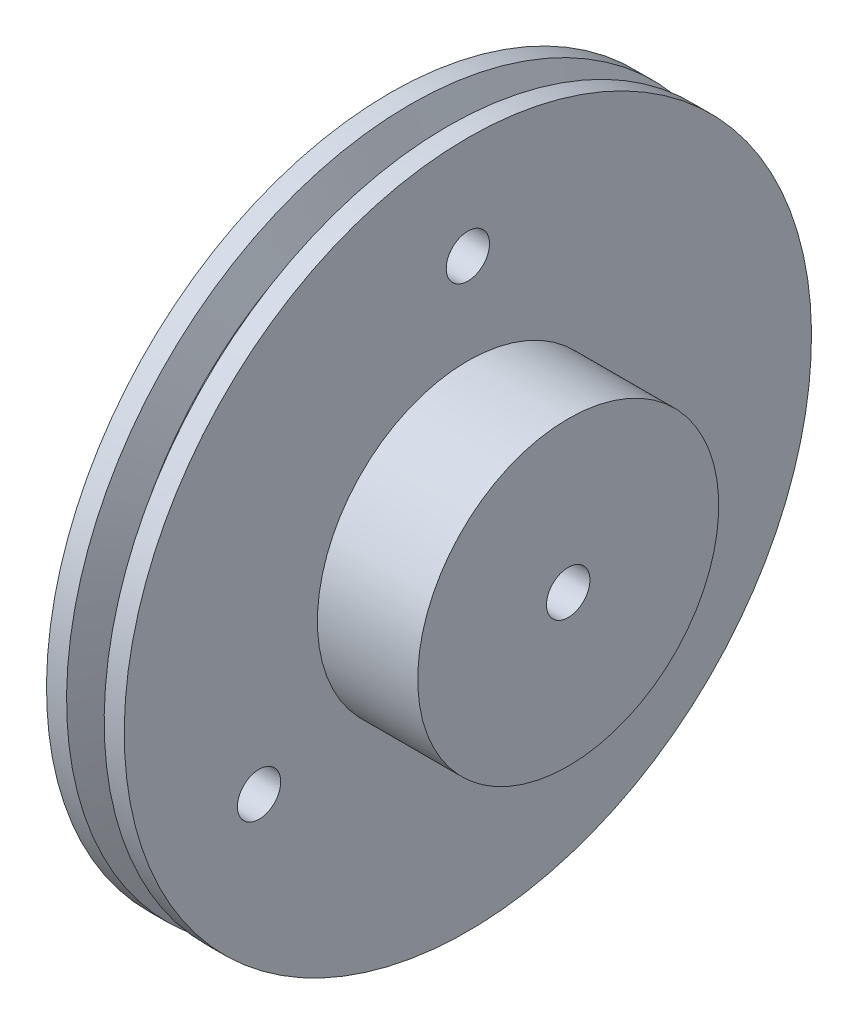
ISO-10303-21;
HEADER;
FILE_DESCRIPTION(('STEP AP214'),'2;1');
FILE_NAME('part.step','',(''),(''),'','','');
FILE_SCHEMA(('AUTOMOTIVE_DESIGN { 1 0 10303 214 1 1 1 1 }'));
ENDSEC;
DATA;
#1=APPLICATION_CONTEXT('core data for automotive mechanical design processes');
#2=APPLICATION_PROTOCOL_DEFINITION('international standard','automotive_design',2000,#1);
#3=PRODUCT_CONTEXT('',#1,'mechanical');
#4=PRODUCT('Part','Part','',(#3));
#5=PRODUCT_RELATED_PRODUCT_CATEGORY('part','',(#4));
#6=PRODUCT_DEFINITION_FORMATION('','',#4);
#7=PRODUCT_DEFINITION_CONTEXT('part definition',#1,'design');
#8=PRODUCT_DEFINITION('design','',#6,#7);
#9=PRODUCT_DEFINITION_SHAPE('','',#8);
#10=(LENGTH_UNIT() NAMED_UNIT(*) SI_UNIT(.MILLI.,.METRE.));
#11=(NAMED_UNIT(*) PLANE_ANGLE_UNIT() SI_UNIT($,.RADIAN.));
#12=(NAMED_UNIT(*) SI_UNIT($,.STERADIAN.) SOLID_ANGLE_UNIT());
#13=UNCERTAINTY_MEASURE_WITH_UNIT(LENGTH_MEASURE(1.E-05),#10,'distance_accuracy_value','');
#14=(GEOMETRIC_REPRESENTATION_CONTEXT(3) GLOBAL_UNCERTAINTY_ASSIGNED_CONTEXT((#13)) GLOBAL_UNIT_ASSIGNED_CONTEXT((#10,
#11,#12)) REPRESENTATION_CONTEXT('',''));
#15=CARTESIAN_POINT('',(0.,0.,0.));
#16=DIRECTION('',(0.,0.,1.));
#17=DIRECTION('',(1.,0.,0.));
#18=AXIS2_PLACEMENT_3D('',#15,#16,#17);
#19=CARTESIAN_POINT('',(0.,0.,0.));
#20=DIRECTION('',(-1.,0.,0.));
#21=DIRECTION('',(0.,-1.,0.));
#22=AXIS2_PLACEMENT_3D('',#19,#20,#21);
#23=PLANE('',#22);
#24=CARTESIAN_POINT('',(0.,61.0398885653455,0.));
#25=DIRECTION('',(1.,0.,0.));
#26=DIRECTION('',(0.,1.,0.));
#27=AXIS2_PLACEMENT_3D('',#24,#25,#26);
#28=CIRCLE('',#27,5.48117719171677);
#29=CARTESIAN_POINT('',(0.,66.5210657570623,0.));
#30=VERTEX_POINT('',#29);
#31=EDGE_CURVE('E70',#30,#30,#28,.T.);
#32=ORIENTED_EDGE('',*,*,#31,.T.);
#33=EDGE_LOOP('',(#32));
#34=FACE_BOUND('',#33,.T.);
#35=CARTESIAN_POINT('',(0.,-30.5199442826705,-52.8620941417644));
#36=DIRECTION('',(1.,0.,0.));
#37=DIRECTION('',(0.,1.,0.));
#38=AXIS2_PLACEMENT_3D('',#35,#36,#37);
#39=CIRCLE('',#38,5.48117719172016);
#40=CARTESIAN_POINT('',(0.,-25.0387670909503,-52.8620941417644));
#41=VERTEX_POINT('',#40);
#42=EDGE_CURVE('E79',#41,#41,#39,.T.);
#43=ORIENTED_EDGE('',*,*,#42,.T.);
#44=EDGE_LOOP('',(#43));
#45=FACE_BOUND('',#44,.T.);
#46=CARTESIAN_POINT('',(0.,-30.519944282675,52.8620941417566));
#47=DIRECTION('',(1.,0.,0.));
#48=DIRECTION('',(0.,1.,0.));
#49=AXIS2_PLACEMENT_3D('',#46,#47,#48);
#50=CIRCLE('',#49,5.48117719172171);
#51=CARTESIAN_POINT('',(0.,-25.0387670909533,52.8620941417566));
#52=VERTEX_POINT('',#51);
#53=EDGE_CURVE('E73',#52,#52,#50,.T.);
#54=ORIENTED_EDGE('',*,*,#53,.T.);
#55=EDGE_LOOP('',(#54));
#56=FACE_BOUND('',#55,.T.);
#57=CARTESIAN_POINT('',(0.,0.,0.));
#58=DIRECTION('',(1.,0.,0.));
#59=DIRECTION('',(0.,1.,0.));
#60=AXIS2_PLACEMENT_3D('',#57,#58,#59);
#61=CIRCLE('',#60,5.5);
#62=CARTESIAN_POINT('',(0.,5.5,0.));
#63=VERTEX_POINT('',#62);
#64=EDGE_CURVE('E66',#63,#63,#61,.T.);
#65=ORIENTED_EDGE('',*,*,#64,.T.);
#66=EDGE_LOOP('',(#65));
#67=FACE_BOUND('',#66,.T.);
#68=CARTESIAN_POINT('',(0.,0.,0.));
#69=DIRECTION('',(1.,0.,0.));
#70=DIRECTION('',(0.,1.,0.));
#71=AXIS2_PLACEMENT_3D('',#68,#69,#70);
#72=CIRCLE('',#71,86.995);
#73=CARTESIAN_POINT('',(0.,86.995,0.));
#74=VERTEX_POINT('',#73);
#75=EDGE_CURVE('E10',#74,#74,#72,.T.);
#76=ORIENTED_EDGE('',*,*,#75,.F.);
#77=EDGE_LOOP('',(#76));
#78=FACE_BOUND('',#77,.T.);
#79=ADVANCED_FACE('F35',(#34,#45,#56,#67,#78),#23,.T.);
#80=CARTESIAN_POINT('',(45.085,0.,0.));
#81=DIRECTION('',(1.,0.,0.));
#82=DIRECTION('',(0.,1.,0.));
#83=AXIS2_PLACEMENT_3D('',#80,#81,#82);
#84=CYLINDRICAL_SURFACE('',#83,86.995);
#85=ORIENTED_EDGE('',*,*,#75,.T.);
#86=EDGE_LOOP('',(#85));
#87=FACE_BOUND('',#86,.T.);
#88=CARTESIAN_POINT('',(5.08,0.,0.));
#89=DIRECTION('',(1.,0.,0.));
#90=DIRECTION('',(0.,1.,0.));
#91=AXIS2_PLACEMENT_3D('',#88,#89,#90);
#92=CIRCLE('',#91,86.995);
#93=CARTESIAN_POINT('',(5.08000000000002,86.995,0.));
#94=VERTEX_POINT('',#93);
#95=EDGE_CURVE('E41',#94,#94,#92,.T.);
#96=ORIENTED_EDGE('',*,*,#95,.F.);
#97=EDGE_LOOP('',(#96));
#98=FACE_BOUND('',#97,.T.);
#99=ADVANCED_FACE('F132',(#87,#98),#84,.T.);
#100=CARTESIAN_POINT('',(8.78131703660531,0.,0.));
#101=DIRECTION('',(-1.,0.,0.));
#102=DIRECTION('',(0.,-1.,0.));
#103=AXIS2_PLACEMENT_3D('',#100,#101,#102);
#104=CONICAL_SURFACE('',#103,79.0575,1.13446401379631);
#105=ORIENTED_EDGE('',*,*,#95,.T.);
#106=EDGE_LOOP('',(#105));
#107=FACE_BOUND('',#106,.T.);
#108=CARTESIAN_POINT('',(8.78131703660531,0.,0.));
#109=DIRECTION('',(1.,0.,0.));
#110=DIRECTION('',(0.,1.,0.));
#111=AXIS2_PLACEMENT_3D('',#108,#109,#110);
#112=CIRCLE('',#111,79.0575);
#113=CARTESIAN_POINT('',(8.78131703660532,79.0575,0.));
#114=VERTEX_POINT('',#113);
#115=EDGE_CURVE('E45',#114,#114,#112,.T.);
#116=ORIENTED_EDGE('',*,*,#115,.F.);
#117=EDGE_LOOP('',(#116));
#118=FACE_BOUND('',#117,.T.);
#119=ADVANCED_FACE('F136',(#107,#118),#104,.T.);
#120=CARTESIAN_POINT('',(45.085,0.,0.));
#121=DIRECTION('',(1.,0.,0.));
#122=DIRECTION('',(0.,1.,0.));
#123=AXIS2_PLACEMENT_3D('',#120,#121,#122);
#124=CYLINDRICAL_SURFACE('',#123,79.0575);
#125=ORIENTED_EDGE('',*,*,#115,.T.);
#126=EDGE_LOOP('',(#125));
#127=FACE_BOUND('',#126,.T.);
#128=CARTESIAN_POINT('',(10.9036829633947,0.,0.));
#129=DIRECTION('',(1.,0.,0.));
#130=DIRECTION('',(0.,1.,0.));
#131=AXIS2_PLACEMENT_3D('',#128,#129,#130);
#132=CIRCLE('',#131,79.0575);
#133=CARTESIAN_POINT('',(10.9036829633947,79.0575,0.));
#134=VERTEX_POINT('',#133);
#135=EDGE_CURVE('E49',#134,#134,#132,.T.);
#136=ORIENTED_EDGE('',*,*,#135,.F.);
#137=EDGE_LOOP('',(#136));
#138=FACE_BOUND('',#137,.T.);
#139=ADVANCED_FACE('F140',(#127,#138),#124,.T.);
#140=CARTESIAN_POINT('',(14.605,0.,0.));
#141=DIRECTION('',(1.,0.,0.));
#142=DIRECTION('',(0.,1.,0.));
#143=AXIS2_PLACEMENT_3D('',#140,#141,#142);
#144=CONICAL_SURFACE('',#143,86.995,1.13446401379631);
#145=ORIENTED_EDGE('',*,*,#135,.T.);
#146=EDGE_LOOP('',(#145));
#147=FACE_BOUND('',#146,.T.);
#148=CARTESIAN_POINT('',(14.605,0.,0.));
#149=DIRECTION('',(1.,0.,0.));
#150=DIRECTION('',(0.,1.,0.));
#151=AXIS2_PLACEMENT_3D('',#148,#149,#150);
#152=CIRCLE('',#151,86.995);
#153=CARTESIAN_POINT('',(14.605,86.995,0.));
#154=VERTEX_POINT('',#153);
#155=EDGE_CURVE('E54',#154,#154,#152,.T.);
#156=ORIENTED_EDGE('',*,*,#155,.F.);
#157=EDGE_LOOP('',(#156));
#158=FACE_BOUND('',#157,.T.);
#159=ADVANCED_FACE('F146',(#147,#158),#144,.T.);
#160=CARTESIAN_POINT('',(45.085,0.,0.));
#161=DIRECTION('',(1.,0.,0.));
#162=DIRECTION('',(0.,1.,0.));
#163=AXIS2_PLACEMENT_3D('',#160,#161,#162);
#164=CYLINDRICAL_SURFACE('',#163,86.995);
#165=ORIENTED_EDGE('',*,*,#155,.T.);
#166=EDGE_LOOP('',(#165));
#167=FACE_BOUND('',#166,.T.);
#168=CARTESIAN_POINT('',(19.685,0.,0.));
#169=DIRECTION('',(1.,0.,0.));
#170=DIRECTION('',(0.,1.,0.));
#171=AXIS2_PLACEMENT_3D('',#168,#169,#170);
#172=CIRCLE('',#171,86.995);
#173=CARTESIAN_POINT('',(19.685,86.995,0.));
#174=VERTEX_POINT('',#173);
#175=EDGE_CURVE('E57',#174,#174,#172,.T.);
#176=ORIENTED_EDGE('',*,*,#175,.F.);
#177=EDGE_LOOP('',(#176));
#178=FACE_BOUND('',#177,.T.);
#179=ADVANCED_FACE('F104',(#167,#178),#164,.T.);
#180=CARTESIAN_POINT('',(19.685,86.995,0.));
#181=DIRECTION('',(1.,0.,0.));
#182=DIRECTION('',(0.,1.,0.));
#183=AXIS2_PLACEMENT_3D('',#180,#181,#182);
#184=PLANE('',#183);
#185=CARTESIAN_POINT('',(19.685,61.0398885653455,0.));
#186=DIRECTION('',(1.,0.,0.));
#187=DIRECTION('',(0.,1.,0.));
#188=AXIS2_PLACEMENT_3D('',#185,#186,#187);
#189=CIRCLE('',#188,5.48117719171677);
#190=CARTESIAN_POINT('',(19.685,66.5210657570623,0.));
#191=VERTEX_POINT('',#190);
#192=EDGE_CURVE('E85',#191,#191,#189,.T.);
#193=ORIENTED_EDGE('',*,*,#192,.F.);
#194=EDGE_LOOP('',(#193));
#195=FACE_BOUND('',#194,.T.);
#196=CARTESIAN_POINT('',(19.685,-30.5199442826705,-52.8620941417644));
#197=DIRECTION('',(1.,0.,0.));
#198=DIRECTION('',(0.,1.,0.));
#199=AXIS2_PLACEMENT_3D('',#196,#197,#198);
#200=CIRCLE('',#199,5.48117719172016);
#201=CARTESIAN_POINT('',(19.685,-25.0387670909503,-52.8620941417644));
#202=VERTEX_POINT('',#201);
#203=EDGE_CURVE('E82',#202,#202,#200,.T.);
#204=ORIENTED_EDGE('',*,*,#203,.F.);
#205=EDGE_LOOP('',(#204));
#206=FACE_BOUND('',#205,.T.);
#207=CARTESIAN_POINT('',(19.685,-30.519944282675,52.8620941417566));
#208=DIRECTION('',(1.,0.,0.));
#209=DIRECTION('',(0.,1.,0.));
#210=AXIS2_PLACEMENT_3D('',#207,#208,#209);
#211=CIRCLE('',#210,5.48117719172171);
#212=CARTESIAN_POINT('',(19.685,-25.0387670909533,52.8620941417566));
#213=VERTEX_POINT('',#212);
#214=EDGE_CURVE('E76',#213,#213,#211,.T.);
#215=ORIENTED_EDGE('',*,*,#214,.F.);
#216=EDGE_LOOP('',(#215));
#217=FACE_BOUND('',#216,.T.);
#218=ORIENTED_EDGE('',*,*,#175,.T.);
#219=EDGE_LOOP('',(#218));
#220=FACE_BOUND('',#219,.T.);
#221=CARTESIAN_POINT('',(19.685,0.,0.));
#222=DIRECTION('',(1.,0.,0.));
#223=DIRECTION('',(0.,1.,0.));
#224=AXIS2_PLACEMENT_3D('',#221,#222,#223);
#225=CIRCLE('',#224,38.1);
#226=CARTESIAN_POINT('',(19.685,38.1,0.));
#227=VERTEX_POINT('',#226);
#228=EDGE_CURVE('E60',#227,#227,#225,.T.);
#229=ORIENTED_EDGE('',*,*,#228,.F.);
#230=EDGE_LOOP('',(#229));
#231=FACE_BOUND('',#230,.T.);
#232=ADVANCED_FACE('F100',(#195,#206,#217,#220,#231),#184,.T.);
#233=CARTESIAN_POINT('',(45.085,0.,0.));
#234=DIRECTION('',(1.,0.,0.));
#235=DIRECTION('',(0.,1.,0.));
#236=AXIS2_PLACEMENT_3D('',#233,#234,#235);
#237=CYLINDRICAL_SURFACE('',#236,38.1);
#238=ORIENTED_EDGE('',*,*,#228,.T.);
#239=EDGE_LOOP('',(#238));
#240=FACE_BOUND('',#239,.T.);
#241=CARTESIAN_POINT('',(45.085,0.,0.));
#242=DIRECTION('',(1.,0.,0.));
#243=DIRECTION('',(0.,1.,0.));
#244=AXIS2_PLACEMENT_3D('',#241,#242,#243);
#245=CIRCLE('',#244,38.1);
#246=CARTESIAN_POINT('',(45.085,38.1,0.));
#247=VERTEX_POINT('',#246);
#248=EDGE_CURVE('E63',#247,#247,#245,.T.);
#249=ORIENTED_EDGE('',*,*,#248,.F.);
#250=EDGE_LOOP('',(#249));
#251=FACE_BOUND('',#250,.T.);
#252=ADVANCED_FACE('F103',(#240,#251),#237,.T.);
#253=CARTESIAN_POINT('',(45.085,38.1,0.));
#254=DIRECTION('',(1.,0.,0.));
#255=DIRECTION('',(0.,1.,0.));
#256=AXIS2_PLACEMENT_3D('',#253,#254,#255);
#257=PLANE('',#256);
#258=CARTESIAN_POINT('',(45.085,0.,0.));
#259=DIRECTION('',(1.,0.,0.));
#260=DIRECTION('',(0.,1.,0.));
#261=AXIS2_PLACEMENT_3D('',#258,#259,#260);
#262=CIRCLE('',#261,5.5);
#263=CARTESIAN_POINT('',(45.085,5.49999999999999,0.));
#264=VERTEX_POINT('',#263);
#265=EDGE_CURVE('E67',#264,#264,#262,.T.);
#266=ORIENTED_EDGE('',*,*,#265,.F.);
#267=EDGE_LOOP('',(#266));
#268=FACE_BOUND('',#267,.T.);
#269=ORIENTED_EDGE('',*,*,#248,.T.);
#270=EDGE_LOOP('',(#269));
#271=FACE_BOUND('',#270,.T.);
#272=ADVANCED_FACE('F116',(#268,#271),#257,.T.);
#273=CARTESIAN_POINT('',(0.,0.,0.));
#274=DIRECTION('',(1.,0.,0.));
#275=DIRECTION('',(0.,1.,0.));
#276=AXIS2_PLACEMENT_3D('',#273,#274,#275);
#277=CYLINDRICAL_SURFACE('',#276,5.5);
#278=CARTESIAN_POINT('',(0.,5.5,0.));
#279=CARTESIAN_POINT('',(0.469635416666647,5.5,0.));
#280=CARTESIAN_POINT('',(0.939270833333315,5.5,0.));
#281=CARTESIAN_POINT('',(1.87854166666665,5.5,0.));
#282=CARTESIAN_POINT('',(2.34817708333332,5.5,0.));
#283=CARTESIAN_POINT('',(3.28744791666665,5.5,0.));
#284=CARTESIAN_POINT('',(3.75708333333332,5.5,0.));
#285=CARTESIAN_POINT('',(4.69635416666665,5.5,0.));
#286=CARTESIAN_POINT('',(5.16598958333332,5.5,0.));
#287=CARTESIAN_POINT('',(6.10526041666665,5.5,0.));
#288=CARTESIAN_POINT('',(6.57489583333332,5.5,0.));
#289=CARTESIAN_POINT('',(7.51416666666666,5.5,0.));
#290=CARTESIAN_POINT('',(7.98380208333332,5.5,0.));
#291=CARTESIAN_POINT('',(8.92307291666666,5.5,0.));
#292=CARTESIAN_POINT('',(9.39270833333332,5.5,0.));
#293=CARTESIAN_POINT('',(10.3319791666667,5.5,0.));
#294=CARTESIAN_POINT('',(10.8016145833333,5.5,0.));
#295=CARTESIAN_POINT('',(11.7408854166667,5.5,0.));
#296=CARTESIAN_POINT('',(12.2105208333333,5.5,0.));
#297=CARTESIAN_POINT('',(13.1497916666667,5.5,0.));
#298=CARTESIAN_POINT('',(13.6194270833333,5.5,0.));
#299=CARTESIAN_POINT('',(14.5586979166667,5.5,0.));
#300=CARTESIAN_POINT('',(15.0283333333333,5.5,0.));
#301=CARTESIAN_POINT('',(15.9676041666667,5.5,0.));
#302=CARTESIAN_POINT('',(16.4372395833333,5.5,0.));
#303=CARTESIAN_POINT('',(17.3765104166667,5.5,0.));
#304=CARTESIAN_POINT('',(17.8461458333333,5.5,0.));
#305=CARTESIAN_POINT('',(18.7854166666667,5.5,0.));
#306=CARTESIAN_POINT('',(19.2550520833333,5.5,0.));
#307=CARTESIAN_POINT('',(20.1943229166667,5.5,0.));
#308=CARTESIAN_POINT('',(20.6639583333333,5.5,0.));
#309=CARTESIAN_POINT('',(21.6032291666667,5.5,0.));
#310=CARTESIAN_POINT('',(22.0728645833333,5.49999999999999,0.));
#311=CARTESIAN_POINT('',(23.0121354166667,5.49999999999999,0.));
#312=CARTESIAN_POINT('',(23.4817708333333,5.49999999999999,0.));
#313=CARTESIAN_POINT('',(24.4210416666667,5.49999999999999,0.));
#314=CARTESIAN_POINT('',(24.8906770833333,5.49999999999999,0.));
#315=CARTESIAN_POINT('',(25.8299479166667,5.49999999999999,0.));
#316=CARTESIAN_POINT('',(26.2995833333333,5.49999999999999,0.));
#317=CARTESIAN_POINT('',(27.2388541666667,5.49999999999999,0.));
#318=CARTESIAN_POINT('',(27.7084895833333,5.49999999999999,0.));
#319=CARTESIAN_POINT('',(28.6477604166667,5.49999999999999,0.));
#320=CARTESIAN_POINT('',(29.1173958333333,5.49999999999999,0.));
#321=CARTESIAN_POINT('',(30.0566666666667,5.49999999999999,0.));
#322=CARTESIAN_POINT('',(30.5263020833333,5.49999999999999,0.));
#323=CARTESIAN_POINT('',(31.4655729166667,5.49999999999999,0.));
#324=CARTESIAN_POINT('',(31.9352083333333,5.49999999999999,0.));
#325=CARTESIAN_POINT('',(32.8744791666667,5.49999999999999,0.));
#326=CARTESIAN_POINT('',(33.3441145833334,5.49999999999999,0.));
#327=CARTESIAN_POINT('',(34.2833854166667,5.49999999999999,0.));
#328=CARTESIAN_POINT('',(34.7530208333334,5.49999999999999,0.));
#329=CARTESIAN_POINT('',(35.6922916666667,5.49999999999999,0.));
#330=CARTESIAN_POINT('',(36.1619270833334,5.49999999999999,0.));
#331=CARTESIAN_POINT('',(37.1011979166667,5.49999999999999,0.));
#332=CARTESIAN_POINT('',(37.5708333333334,5.49999999999999,0.));
#333=CARTESIAN_POINT('',(38.5101041666667,5.49999999999999,0.));
#334=CARTESIAN_POINT('',(38.9797395833334,5.49999999999999,0.));
#335=CARTESIAN_POINT('',(39.9190104166667,5.49999999999999,0.));
#336=CARTESIAN_POINT('',(40.3886458333334,5.49999999999999,0.));
#337=CARTESIAN_POINT('',(41.3279166666667,5.49999999999999,0.));
#338=CARTESIAN_POINT('',(41.7975520833334,5.49999999999999,0.));
#339=CARTESIAN_POINT('',(42.7368229166667,5.49999999999999,0.));
#340=CARTESIAN_POINT('',(43.2064583333334,5.49999999999999,0.));
#341=CARTESIAN_POINT('',(44.1457291666667,5.49999999999999,0.));
#342=CARTESIAN_POINT('',(44.6153645833334,5.49999999999999,0.));
#343=CARTESIAN_POINT('',(45.085,5.49999999999999,0.));
#344=B_SPLINE_CURVE_WITH_KNOTS('',3,(#278,#279,#280,#281,#282,#283,#284,#285,#286,#287,#288,
#289,#290,#291,#292,#293,#294,#295,#296,#297,#298,#299,#300,#301,#302,#303,#304,#305,#306,#307,
#308,#309,#310,#311,#312,#313,#314,#315,#316,#317,#318,#319,#320,#321,#322,#323,#324,#325,#326,
#327,#328,#329,#330,#331,#332,#333,#334,#335,#336,#337,#338,#339,#340,#341,#342,#343),
.UNSPECIFIED.,.F.,.F.,(4,2,2,2,2,2,2,2,2,2,2,2,2,2,2,2,2,2,2,2,2,2,2,2,2,2,2,2,2,2,2,2,4),(0.,
1.40890625,2.8178125,4.22671875,5.63562500000001,7.04453125000001,8.45343750000001,
9.86234375000001,11.27125,12.68015625,14.0890625,15.49796875,16.906875,18.31578125,19.7246875,
21.13359375,22.5425,23.95140625,25.3603125,26.76921875,28.178125,29.58703125,30.9959375,
32.40484375,33.81375,35.22265625,36.6315625,38.04046875,39.449375,40.85828125,42.2671875,
43.67609375,45.085),.UNSPECIFIED.);
#345=EDGE_CURVE('BSEAM121',#63,#264,#344,.T.);
#346=ORIENTED_EDGE('',*,*,#64,.F.);
#347=ORIENTED_EDGE('',*,*,#265,.T.);
#348=ORIENTED_EDGE('',*,*,#345,.T.);
#349=ORIENTED_EDGE('',*,*,#345,.F.);
#350=EDGE_LOOP('',(#346,#348,#347,#349));
#351=FACE_BOUND('',#350,.T.);
#352=ADVANCED_FACE('F121',(#351),#277,.F.);
#353=CARTESIAN_POINT('',(0.,-30.519944282675,52.8620941417566));
#354=DIRECTION('',(1.,0.,0.));
#355=DIRECTION('',(0.,1.,0.));
#356=AXIS2_PLACEMENT_3D('',#353,#354,#355);
#357=CYLINDRICAL_SURFACE('',#356,5.48117719172171);
#358=CARTESIAN_POINT('',(0.,-25.0387670909533,52.8620941417566));
#359=CARTESIAN_POINT('',(0.20505208333329,-25.0387670909533,52.8620941417566));
#360=CARTESIAN_POINT('',(0.410104166666623,-25.0387670909533,52.8620941417566));
#361=CARTESIAN_POINT('',(0.820208333333291,-25.0387670909533,52.8620941417566));
#362=CARTESIAN_POINT('',(1.02526041666662,-25.0387670909533,52.8620941417566));
#363=CARTESIAN_POINT('',(1.43536458333329,-25.0387670909533,52.8620941417566));
#364=CARTESIAN_POINT('',(1.64041666666663,-25.0387670909533,52.8620941417566));
#365=CARTESIAN_POINT('',(2.05052083333329,-25.0387670909533,52.8620941417566));
#366=CARTESIAN_POINT('',(2.25557291666663,-25.0387670909533,52.8620941417566));
#367=CARTESIAN_POINT('',(2.66567708333329,-25.0387670909533,52.8620941417566));
#368=CARTESIAN_POINT('',(2.87072916666663,-25.0387670909533,52.8620941417566));
#369=CARTESIAN_POINT('',(3.2808333333333,-25.0387670909533,52.8620941417566));
#370=CARTESIAN_POINT('',(3.48588541666663,-25.0387670909533,52.8620941417566));
#371=CARTESIAN_POINT('',(3.8959895833333,-25.0387670909533,52.8620941417566));
#372=CARTESIAN_POINT('',(4.10104166666663,-25.0387670909533,52.8620941417566));
#373=CARTESIAN_POINT('',(4.5111458333333,-25.0387670909533,52.8620941417566));
#374=CARTESIAN_POINT('',(4.71619791666663,-25.0387670909533,52.8620941417566));
#375=CARTESIAN_POINT('',(5.1263020833333,-25.0387670909533,52.8620941417566));
#376=CARTESIAN_POINT('',(5.33135416666663,-25.0387670909533,52.8620941417566));
#377=CARTESIAN_POINT('',(5.7414583333333,-25.0387670909533,52.8620941417566));
#378=CARTESIAN_POINT('',(5.94651041666663,-25.0387670909533,52.8620941417566));
#379=CARTESIAN_POINT('',(6.3566145833333,-25.0387670909533,52.8620941417566));
#380=CARTESIAN_POINT('',(6.56166666666663,-25.0387670909533,52.8620941417566));
#381=CARTESIAN_POINT('',(6.9717708333333,-25.0387670909533,52.8620941417566));
#382=CARTESIAN_POINT('',(7.17682291666663,-25.0387670909533,52.8620941417566));
#383=CARTESIAN_POINT('',(7.5869270833333,-25.0387670909533,52.8620941417566));
#384=CARTESIAN_POINT('',(7.79197916666664,-25.0387670909533,52.8620941417566));
#385=CARTESIAN_POINT('',(8.2020833333333,-25.0387670909533,52.8620941417566));
#386=CARTESIAN_POINT('',(8.40713541666664,-25.0387670909533,52.8620941417566));
#387=CARTESIAN_POINT('',(8.8172395833333,-25.0387670909533,52.8620941417566));
#388=CARTESIAN_POINT('',(9.02229166666664,-25.0387670909533,52.8620941417566));
#389=CARTESIAN_POINT('',(9.4323958333333,-25.0387670909533,52.8620941417566));
#390=CARTESIAN_POINT('',(9.63744791666664,-25.0387670909533,52.8620941417566));
#391=CARTESIAN_POINT('',(10.0475520833333,-25.0387670909533,52.8620941417566));
#392=CARTESIAN_POINT('',(10.2526041666666,-25.0387670909533,52.8620941417566));
#393=CARTESIAN_POINT('',(10.6627083333333,-25.0387670909533,52.8620941417566));
#394=CARTESIAN_POINT('',(10.8677604166666,-25.0387670909533,52.8620941417566));
#395=CARTESIAN_POINT('',(11.2778645833333,-25.0387670909533,52.8620941417566));
#396=CARTESIAN_POINT('',(11.4829166666666,-25.0387670909533,52.8620941417566));
#397=CARTESIAN_POINT('',(11.8930208333333,-25.0387670909533,52.8620941417566));
#398=CARTESIAN_POINT('',(12.0980729166666,-25.0387670909533,52.8620941417566));
#399=CARTESIAN_POINT('',(12.5081770833333,-25.0387670909533,52.8620941417566));
#400=CARTESIAN_POINT('',(12.7132291666666,-25.0387670909533,52.8620941417566));
#401=CARTESIAN_POINT('',(13.1233333333333,-25.0387670909533,52.8620941417566));
#402=CARTESIAN_POINT('',(13.3283854166666,-25.0387670909533,52.8620941417566));
#403=CARTESIAN_POINT('',(13.7384895833333,-25.0387670909533,52.8620941417566));
#404=CARTESIAN_POINT('',(13.9435416666666,-25.0387670909533,52.8620941417566));
#405=CARTESIAN_POINT('',(14.3536458333333,-25.0387670909533,52.8620941417566));
#406=CARTESIAN_POINT('',(14.5586979166666,-25.0387670909533,52.8620941417566));
#407=CARTESIAN_POINT('',(14.9688020833333,-25.0387670909533,52.8620941417566));
#408=CARTESIAN_POINT('',(15.1738541666666,-25.0387670909533,52.8620941417566));
#409=CARTESIAN_POINT('',(15.5839583333333,-25.0387670909533,52.8620941417566));
#410=CARTESIAN_POINT('',(15.7890104166666,-25.0387670909533,52.8620941417566));
#411=CARTESIAN_POINT('',(16.1991145833333,-25.0387670909533,52.8620941417566));
#412=CARTESIAN_POINT('',(16.4041666666666,-25.0387670909533,52.8620941417566));
#413=CARTESIAN_POINT('',(16.8142708333333,-25.0387670909533,52.8620941417566));
#414=CARTESIAN_POINT('',(17.0193229166666,-25.0387670909533,52.8620941417566));
#415=CARTESIAN_POINT('',(17.4294270833333,-25.0387670909533,52.8620941417566));
#416=CARTESIAN_POINT('',(17.6344791666667,-25.0387670909533,52.8620941417566));
#417=CARTESIAN_POINT('',(18.0445833333333,-25.0387670909533,52.8620941417566));
#418=CARTESIAN_POINT('',(18.2496354166666,-25.0387670909533,52.8620941417566));
#419=CARTESIAN_POINT('',(18.6597395833333,-25.0387670909533,52.8620941417566));
#420=CARTESIAN_POINT('',(18.8647916666667,-25.0387670909533,52.8620941417566));
#421=CARTESIAN_POINT('',(19.2748958333333,-25.0387670909533,52.8620941417566));
#422=CARTESIAN_POINT('',(19.4799479166667,-25.0387670909533,52.8620941417566));
#423=CARTESIAN_POINT('',(19.685,-25.0387670909533,52.8620941417566));
#424=B_SPLINE_CURVE_WITH_KNOTS('',3,(#358,#359,#360,#361,#362,#363,#364,#365,#366,#367,#368,
#369,#370,#371,#372,#373,#374,#375,#376,#377,#378,#379,#380,#381,#382,#383,#384,#385,#386,#387,
#388,#389,#390,#391,#392,#393,#394,#395,#396,#397,#398,#399,#400,#401,#402,#403,#404,#405,#406,
#407,#408,#409,#410,#411,#412,#413,#414,#415,#416,#417,#418,#419,#420,#421,#422,#423),
.UNSPECIFIED.,.F.,.F.,(4,2,2,2,2,2,2,2,2,2,2,2,2,2,2,2,2,2,2,2,2,2,2,2,2,2,2,2,2,2,2,2,4),(0.,
0.615156250000001,1.2303125,1.84546875,2.460625,3.07578125000001,3.69093750000001,
4.30609375000001,4.92125000000001,5.53640625000001,6.15156250000001,6.76671875000001,
7.38187500000001,7.99703125000002,8.61218750000002,9.22734375000002,9.84250000000002,
10.45765625,11.0728125,11.68796875,12.303125,12.91828125,13.5334375,14.14859375,14.76375,
15.37890625,15.9940625,16.60921875,17.224375,17.83953125,18.4546875,19.06984375,19.685),.UNSPECIFIED.);
#425=EDGE_CURVE('BSEAM127',#52,#213,#424,.T.);
#426=ORIENTED_EDGE('',*,*,#53,.F.);
#427=ORIENTED_EDGE('',*,*,#214,.T.);
#428=ORIENTED_EDGE('',*,*,#425,.T.);
#429=ORIENTED_EDGE('',*,*,#425,.F.);
#430=EDGE_LOOP('',(#426,#428,#427,#429));
#431=FACE_BOUND('',#430,.T.);
#432=ADVANCED_FACE('F127',(#431),#357,.F.);
#433=CARTESIAN_POINT('',(0.,-30.5199442826705,-52.8620941417644));
#434=DIRECTION('',(1.,0.,0.));
#435=DIRECTION('',(0.,1.,0.));
#436=AXIS2_PLACEMENT_3D('',#433,#434,#435);
#437=CYLINDRICAL_SURFACE('',#436,5.48117719172016);
#438=CARTESIAN_POINT('',(0.,-25.0387670909503,-52.8620941417644));
#439=CARTESIAN_POINT('',(0.20505208333329,-25.0387670909503,-52.8620941417644));
#440=CARTESIAN_POINT('',(0.410104166666623,-25.0387670909503,-52.8620941417644));
#441=CARTESIAN_POINT('',(0.820208333333291,-25.0387670909503,-52.8620941417644));
#442=CARTESIAN_POINT('',(1.02526041666662,-25.0387670909503,-52.8620941417644));
#443=CARTESIAN_POINT('',(1.43536458333329,-25.0387670909503,-52.8620941417644));
#444=CARTESIAN_POINT('',(1.64041666666663,-25.0387670909503,-52.8620941417644));
#445=CARTESIAN_POINT('',(2.05052083333329,-25.0387670909503,-52.8620941417644));
#446=CARTESIAN_POINT('',(2.25557291666663,-25.0387670909503,-52.8620941417644));
#447=CARTESIAN_POINT('',(2.66567708333329,-25.0387670909503,-52.8620941417644));
#448=CARTESIAN_POINT('',(2.87072916666663,-25.0387670909503,-52.8620941417644));
#449=CARTESIAN_POINT('',(3.2808333333333,-25.0387670909503,-52.8620941417644));
#450=CARTESIAN_POINT('',(3.48588541666663,-25.0387670909503,-52.8620941417644));
#451=CARTESIAN_POINT('',(3.8959895833333,-25.0387670909503,-52.8620941417644));
#452=CARTESIAN_POINT('',(4.10104166666663,-25.0387670909503,-52.8620941417644));
#453=CARTESIAN_POINT('',(4.5111458333333,-25.0387670909503,-52.8620941417644));
#454=CARTESIAN_POINT('',(4.71619791666663,-25.0387670909503,-52.8620941417644));
#455=CARTESIAN_POINT('',(5.1263020833333,-25.0387670909503,-52.8620941417644));
#456=CARTESIAN_POINT('',(5.33135416666663,-25.0387670909503,-52.8620941417644));
#457=CARTESIAN_POINT('',(5.7414583333333,-25.0387670909503,-52.8620941417644));
#458=CARTESIAN_POINT('',(5.94651041666663,-25.0387670909503,-52.8620941417644));
#459=CARTESIAN_POINT('',(6.3566145833333,-25.0387670909503,-52.8620941417644));
#460=CARTESIAN_POINT('',(6.56166666666663,-25.0387670909503,-52.8620941417644));
#461=CARTESIAN_POINT('',(6.9717708333333,-25.0387670909503,-52.8620941417644));
#462=CARTESIAN_POINT('',(7.17682291666663,-25.0387670909503,-52.8620941417644));
#463=CARTESIAN_POINT('',(7.5869270833333,-25.0387670909503,-52.8620941417644));
#464=CARTESIAN_POINT('',(7.79197916666664,-25.0387670909503,-52.8620941417644));
#465=CARTESIAN_POINT('',(8.2020833333333,-25.0387670909503,-52.8620941417644));
#466=CARTESIAN_POINT('',(8.40713541666664,-25.0387670909503,-52.8620941417644));
#467=CARTESIAN_POINT('',(8.8172395833333,-25.0387670909503,-52.8620941417644));
#468=CARTESIAN_POINT('',(9.02229166666664,-25.0387670909503,-52.8620941417644));
#469=CARTESIAN_POINT('',(9.4323958333333,-25.0387670909503,-52.8620941417644));
#470=CARTESIAN_POINT('',(9.63744791666664,-25.0387670909503,-52.8620941417644));
#471=CARTESIAN_POINT('',(10.0475520833333,-25.0387670909503,-52.8620941417644));
#472=CARTESIAN_POINT('',(10.2526041666666,-25.0387670909503,-52.8620941417644));
#473=CARTESIAN_POINT('',(10.6627083333333,-25.0387670909503,-52.8620941417644));
#474=CARTESIAN_POINT('',(10.8677604166666,-25.0387670909503,-52.8620941417644));
#475=CARTESIAN_POINT('',(11.2778645833333,-25.0387670909503,-52.8620941417644));
#476=CARTESIAN_POINT('',(11.4829166666666,-25.0387670909503,-52.8620941417644));
#477=CARTESIAN_POINT('',(11.8930208333333,-25.0387670909503,-52.8620941417644));
#478=CARTESIAN_POINT('',(12.0980729166666,-25.0387670909503,-52.8620941417644));
#479=CARTESIAN_POINT('',(12.5081770833333,-25.0387670909503,-52.8620941417644));
#480=CARTESIAN_POINT('',(12.7132291666666,-25.0387670909503,-52.8620941417644));
#481=CARTESIAN_POINT('',(13.1233333333333,-25.0387670909503,-52.8620941417644));
#482=CARTESIAN_POINT('',(13.3283854166666,-25.0387670909503,-52.8620941417644));
#483=CARTESIAN_POINT('',(13.7384895833333,-25.0387670909503,-52.8620941417644));
#484=CARTESIAN_POINT('',(13.9435416666666,-25.0387670909503,-52.8620941417644));
#485=CARTESIAN_POINT('',(14.3536458333333,-25.0387670909503,-52.8620941417644));
#486=CARTESIAN_POINT('',(14.5586979166666,-25.0387670909503,-52.8620941417644));
#487=CARTESIAN_POINT('',(14.9688020833333,-25.0387670909503,-52.8620941417644));
#488=CARTESIAN_POINT('',(15.1738541666666,-25.0387670909503,-52.8620941417644));
#489=CARTESIAN_POINT('',(15.5839583333333,-25.0387670909503,-52.8620941417644));
#490=CARTESIAN_POINT('',(15.7890104166666,-25.0387670909503,-52.8620941417644));
#491=CARTESIAN_POINT('',(16.1991145833333,-25.0387670909503,-52.8620941417644));
#492=CARTESIAN_POINT('',(16.4041666666666,-25.0387670909503,-52.8620941417644));
#493=CARTESIAN_POINT('',(16.8142708333333,-25.0387670909503,-52.8620941417644));
#494=CARTESIAN_POINT('',(17.0193229166666,-25.0387670909503,-52.8620941417644));
#495=CARTESIAN_POINT('',(17.4294270833333,-25.0387670909503,-52.8620941417644));
#496=CARTESIAN_POINT('',(17.6344791666667,-25.0387670909503,-52.8620941417644));
#497=CARTESIAN_POINT('',(18.0445833333333,-25.0387670909503,-52.8620941417644));
#498=CARTESIAN_POINT('',(18.2496354166666,-25.0387670909503,-52.8620941417644));
#499=CARTESIAN_POINT('',(18.6597395833333,-25.0387670909503,-52.8620941417644));
#500=CARTESIAN_POINT('',(18.8647916666667,-25.0387670909503,-52.8620941417644));
#501=CARTESIAN_POINT('',(19.2748958333333,-25.0387670909503,-52.8620941417644));
#502=CARTESIAN_POINT('',(19.4799479166667,-25.0387670909503,-52.8620941417644));
#503=CARTESIAN_POINT('',(19.685,-25.0387670909503,-52.8620941417644));
#504=B_SPLINE_CURVE_WITH_KNOTS('',3,(#438,#439,#440,#441,#442,#443,#444,#445,#446,#447,#448,
#449,#450,#451,#452,#453,#454,#455,#456,#457,#458,#459,#460,#461,#462,#463,#464,#465,#466,#467,
#468,#469,#470,#471,#472,#473,#474,#475,#476,#477,#478,#479,#480,#481,#482,#483,#484,#485,#486,
#487,#488,#489,#490,#491,#492,#493,#494,#495,#496,#497,#498,#499,#500,#501,#502,#503),
.UNSPECIFIED.,.F.,.F.,(4,2,2,2,2,2,2,2,2,2,2,2,2,2,2,2,2,2,2,2,2,2,2,2,2,2,2,2,2,2,2,2,4),(0.,
0.615156250000001,1.2303125,1.84546875,2.460625,3.07578125000001,3.69093750000001,
4.30609375000001,4.92125000000001,5.53640625000001,6.15156250000001,6.76671875000001,
7.38187500000001,7.99703125000002,8.61218750000002,9.22734375000002,9.84250000000002,
10.45765625,11.0728125,11.68796875,12.303125,12.91828125,13.5334375,14.14859375,14.76375,
15.37890625,15.9940625,16.60921875,17.224375,17.83953125,18.4546875,19.06984375,19.685),.UNSPECIFIED.);
#505=EDGE_CURVE('BSEAM96',#41,#202,#504,.T.);
#506=ORIENTED_EDGE('',*,*,#42,.F.);
#507=ORIENTED_EDGE('',*,*,#203,.T.);
#508=ORIENTED_EDGE('',*,*,#505,.T.);
#509=ORIENTED_EDGE('',*,*,#505,.F.);
#510=EDGE_LOOP('',(#506,#508,#507,#509));
#511=FACE_BOUND('',#510,.T.);
#512=ADVANCED_FACE('F96',(#511),#437,.F.);
#513=CARTESIAN_POINT('',(0.,61.0398885653455,0.));
#514=DIRECTION('',(1.,0.,0.));
#515=DIRECTION('',(0.,1.,0.));
#516=AXIS2_PLACEMENT_3D('',#513,#514,#515);
#517=CYLINDRICAL_SURFACE('',#516,5.48117719171677);
#518=CARTESIAN_POINT('',(0.,66.5210657570623,0.));
#519=CARTESIAN_POINT('',(0.205052083333311,66.5210657570623,0.));
#520=CARTESIAN_POINT('',(0.410104166666644,66.5210657570623,0.));
#521=CARTESIAN_POINT('',(0.820208333333312,66.5210657570623,0.));
#522=CARTESIAN_POINT('',(1.02526041666665,66.5210657570623,0.));
#523=CARTESIAN_POINT('',(1.43536458333331,66.5210657570623,0.));
#524=CARTESIAN_POINT('',(1.64041666666665,66.5210657570623,0.));
#525=CARTESIAN_POINT('',(2.05052083333331,66.5210657570623,0.));
#526=CARTESIAN_POINT('',(2.25557291666665,66.5210657570623,0.));
#527=CARTESIAN_POINT('',(2.66567708333331,66.5210657570623,0.));
#528=CARTESIAN_POINT('',(2.87072916666665,66.5210657570623,0.));
#529=CARTESIAN_POINT('',(3.28083333333332,66.5210657570623,0.));
#530=CARTESIAN_POINT('',(3.48588541666665,66.5210657570623,0.));
#531=CARTESIAN_POINT('',(3.89598958333332,66.5210657570623,0.));
#532=CARTESIAN_POINT('',(4.10104166666665,66.5210657570623,0.));
#533=CARTESIAN_POINT('',(4.51114583333332,66.5210657570623,0.));
#534=CARTESIAN_POINT('',(4.71619791666665,66.5210657570623,0.));
#535=CARTESIAN_POINT('',(5.12630208333332,66.5210657570623,0.));
#536=CARTESIAN_POINT('',(5.33135416666665,66.5210657570623,0.));
#537=CARTESIAN_POINT('',(5.74145833333332,66.5210657570623,0.));
#538=CARTESIAN_POINT('',(5.94651041666665,66.5210657570623,0.));
#539=CARTESIAN_POINT('',(6.35661458333332,66.5210657570623,0.));
#540=CARTESIAN_POINT('',(6.56166666666665,66.5210657570623,0.));
#541=CARTESIAN_POINT('',(6.97177083333332,66.5210657570623,0.));
#542=CARTESIAN_POINT('',(7.17682291666666,66.5210657570623,0.));
#543=CARTESIAN_POINT('',(7.58692708333332,66.5210657570623,0.));
#544=CARTESIAN_POINT('',(7.79197916666666,66.5210657570623,0.));
#545=CARTESIAN_POINT('',(8.20208333333333,66.5210657570623,0.));
#546=CARTESIAN_POINT('',(8.40713541666666,66.5210657570623,0.));
#547=CARTESIAN_POINT('',(8.81723958333333,66.5210657570623,0.));
#548=CARTESIAN_POINT('',(9.02229166666666,66.5210657570623,0.));
#549=CARTESIAN_POINT('',(9.43239583333333,66.5210657570623,0.));
#550=CARTESIAN_POINT('',(9.63744791666666,66.5210657570623,0.));
#551=CARTESIAN_POINT('',(10.0475520833333,66.5210657570623,0.));
#552=CARTESIAN_POINT('',(10.2526041666667,66.5210657570623,0.));
#553=CARTESIAN_POINT('',(10.6627083333333,66.5210657570623,0.));
#554=CARTESIAN_POINT('',(10.8677604166667,66.5210657570623,0.));
#555=CARTESIAN_POINT('',(11.2778645833333,66.5210657570623,0.));
#556=CARTESIAN_POINT('',(11.4829166666667,66.5210657570623,0.));
#557=CARTESIAN_POINT('',(11.8930208333333,66.5210657570623,0.));
#558=CARTESIAN_POINT('',(12.0980729166667,66.5210657570623,0.));
#559=CARTESIAN_POINT('',(12.5081770833333,66.5210657570623,0.));
#560=CARTESIAN_POINT('',(12.7132291666667,66.5210657570623,0.));
#561=CARTESIAN_POINT('',(13.1233333333333,66.5210657570623,0.));
#562=CARTESIAN_POINT('',(13.3283854166667,66.5210657570623,0.));
#563=CARTESIAN_POINT('',(13.7384895833333,66.5210657570623,0.));
#564=CARTESIAN_POINT('',(13.9435416666667,66.5210657570623,0.));
#565=CARTESIAN_POINT('',(14.3536458333333,66.5210657570623,0.));
#566=CARTESIAN_POINT('',(14.5586979166667,66.5210657570623,0.));
#567=CARTESIAN_POINT('',(14.9688020833333,66.5210657570623,0.));
#568=CARTESIAN_POINT('',(15.1738541666667,66.5210657570623,0.));
#569=CARTESIAN_POINT('',(15.5839583333333,66.5210657570623,0.));
#570=CARTESIAN_POINT('',(15.7890104166667,66.5210657570623,0.));
#571=CARTESIAN_POINT('',(16.1991145833333,66.5210657570623,0.));
#572=CARTESIAN_POINT('',(16.4041666666667,66.5210657570623,0.));
#573=CARTESIAN_POINT('',(16.8142708333333,66.5210657570623,0.));
#574=CARTESIAN_POINT('',(17.0193229166667,66.5210657570623,0.));
#575=CARTESIAN_POINT('',(17.4294270833333,66.5210657570623,0.));
#576=CARTESIAN_POINT('',(17.6344791666667,66.5210657570623,0.));
#577=CARTESIAN_POINT('',(18.0445833333333,66.5210657570623,0.));
#578=CARTESIAN_POINT('',(18.2496354166667,66.5210657570623,0.));
#579=CARTESIAN_POINT('',(18.6597395833333,66.5210657570623,0.));
#580=CARTESIAN_POINT('',(18.8647916666667,66.5210657570623,0.));
#581=CARTESIAN_POINT('',(19.2748958333333,66.5210657570623,0.));
#582=CARTESIAN_POINT('',(19.4799479166667,66.5210657570623,0.));
#583=CARTESIAN_POINT('',(19.685,66.5210657570623,0.));
#584=B_SPLINE_CURVE_WITH_KNOTS('',3,(#518,#519,#520,#521,#522,#523,#524,#525,#526,#527,#528,
#529,#530,#531,#532,#533,#534,#535,#536,#537,#538,#539,#540,#541,#542,#543,#544,#545,#546,#547,
#548,#549,#550,#551,#552,#553,#554,#555,#556,#557,#558,#559,#560,#561,#562,#563,#564,#565,#566,
#567,#568,#569,#570,#571,#572,#573,#574,#575,#576,#577,#578,#579,#580,#581,#582,#583),
.UNSPECIFIED.,.F.,.F.,(4,2,2,2,2,2,2,2,2,2,2,2,2,2,2,2,2,2,2,2,2,2,2,2,2,2,2,2,2,2,2,2,4),(0.,
0.615156250000001,1.2303125,1.84546875,2.460625,3.07578125000001,3.69093750000001,
4.30609375000001,4.92125000000001,5.53640625000001,6.15156250000001,6.76671875000001,
7.38187500000001,7.99703125000002,8.61218750000002,9.22734375000002,9.84250000000002,
10.45765625,11.0728125,11.68796875,12.303125,12.91828125,13.5334375,14.14859375,14.76375,
15.37890625,15.9940625,16.60921875,17.224375,17.83953125,18.4546875,19.06984375,19.685),.UNSPECIFIED.);
#585=EDGE_CURVE('BSEAM93',#30,#191,#584,.T.);
#586=ORIENTED_EDGE('',*,*,#31,.F.);
#587=ORIENTED_EDGE('',*,*,#192,.T.);
#588=ORIENTED_EDGE('',*,*,#585,.T.);
#589=ORIENTED_EDGE('',*,*,#585,.F.);
#590=EDGE_LOOP('',(#586,#588,#587,#589));
#591=FACE_BOUND('',#590,.T.);
#592=ADVANCED_FACE('F93',(#591),#517,.F.);
#593=CLOSED_SHELL('',(#79,#99,#119,#139,#159,#179,#232,#252,#272,#352,#432,#512,#592));
#594=MANIFOLD_SOLID_BREP('B2',#593);
#595=ADVANCED_BREP_SHAPE_REPRESENTATION('',(#18,#594),#14);
#596=SHAPE_DEFINITION_REPRESENTATION(#9,#595);
ENDSEC;
END-ISO-10303-21;
